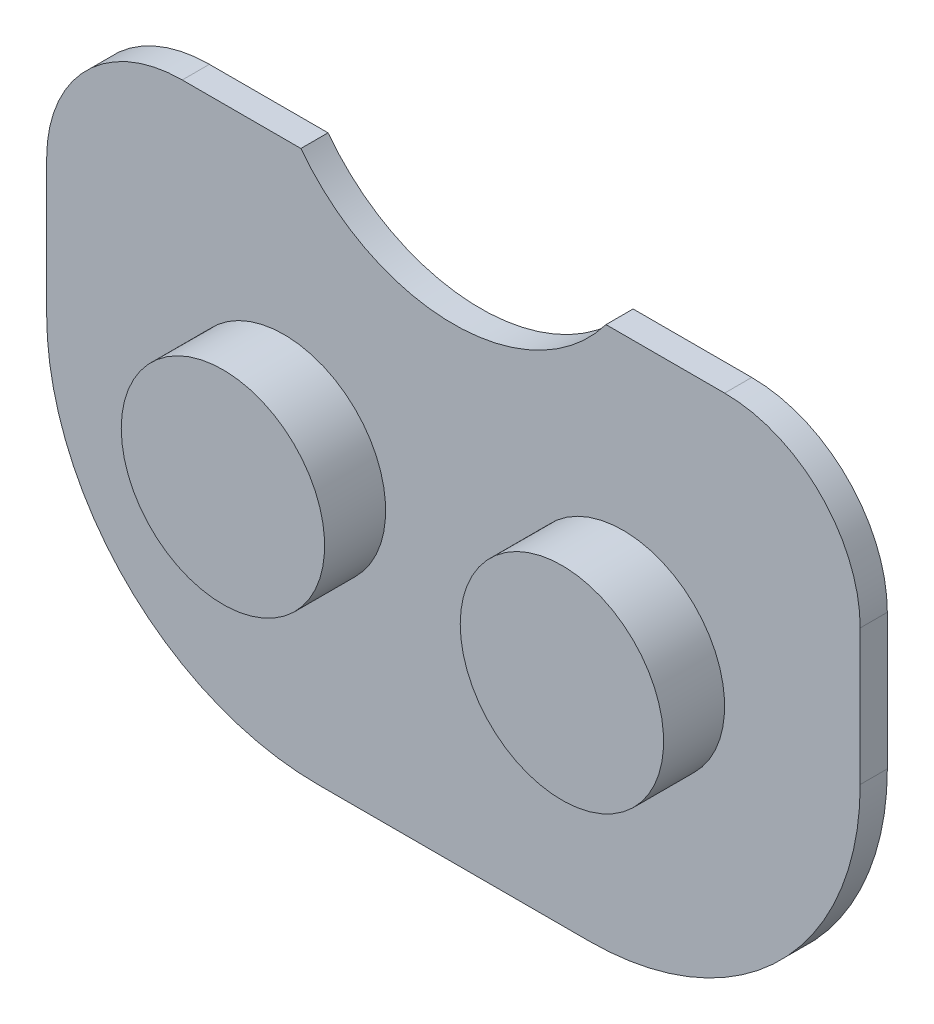
ISO-10303-21;
HEADER;
FILE_DESCRIPTION(('STEP AP214'),'2;1');
FILE_NAME('part.step','',(''),(''),'','','');
FILE_SCHEMA(('AUTOMOTIVE_DESIGN { 1 0 10303 214 1 1 1 1 }'));
ENDSEC;
DATA;
#1=APPLICATION_CONTEXT('core data for automotive mechanical design processes');
#2=APPLICATION_PROTOCOL_DEFINITION('international standard','automotive_design',2000,#1);
#3=PRODUCT_CONTEXT('',#1,'mechanical');
#4=PRODUCT('Part','Part','',(#3));
#5=PRODUCT_RELATED_PRODUCT_CATEGORY('part','',(#4));
#6=PRODUCT_DEFINITION_FORMATION('','',#4);
#7=PRODUCT_DEFINITION_CONTEXT('part definition',#1,'design');
#8=PRODUCT_DEFINITION('design','',#6,#7);
#9=PRODUCT_DEFINITION_SHAPE('','',#8);
#10=(LENGTH_UNIT() NAMED_UNIT(*) SI_UNIT(.MILLI.,.METRE.));
#11=(NAMED_UNIT(*) PLANE_ANGLE_UNIT() SI_UNIT($,.RADIAN.));
#12=(NAMED_UNIT(*) SI_UNIT($,.STERADIAN.) SOLID_ANGLE_UNIT());
#13=UNCERTAINTY_MEASURE_WITH_UNIT(LENGTH_MEASURE(1.E-05),#10,'distance_accuracy_value','');
#14=(GEOMETRIC_REPRESENTATION_CONTEXT(3) GLOBAL_UNCERTAINTY_ASSIGNED_CONTEXT((#13)) GLOBAL_UNIT_ASSIGNED_CONTEXT((#10,
#11,#12)) REPRESENTATION_CONTEXT('',''));
#15=CARTESIAN_POINT('',(0.,0.,0.));
#16=DIRECTION('',(0.,0.,1.));
#17=DIRECTION('',(1.,0.,0.));
#18=AXIS2_PLACEMENT_3D('',#15,#16,#17);
#19=CARTESIAN_POINT('',(-10.,0.,2.));
#20=DIRECTION('',(0.,0.,-1.));
#21=DIRECTION('',(-1.,0.,0.));
#22=AXIS2_PLACEMENT_3D('',#19,#20,#21);
#23=CYLINDRICAL_SURFACE('',#22,20.);
#24=CARTESIAN_POINT('',(-10.,0.,0.));
#25=DIRECTION('',(0.,0.,1.));
#26=DIRECTION('',(1.,0.,0.));
#27=AXIS2_PLACEMENT_3D('',#24,#25,#26);
#28=CIRCLE('',#27,20.);
#29=CARTESIAN_POINT('',(-9.99999999999986,-20.,0.));
#30=VERTEX_POINT('',#29);
#31=CARTESIAN_POINT('',(-30.,1.35308431126191E-13,0.));
#32=VERTEX_POINT('',#31);
#33=EDGE_CURVE('E154',#30,#32,#28,.F.);
#34=ORIENTED_EDGE('',*,*,#33,.F.);
#35=DIRECTION('',(0.,0.,-1.));
#36=VECTOR('',#35,1.);
#37=CARTESIAN_POINT('',(-9.99999999999986,-20.,2.));
#38=LINE('',#37,#36);
#39=CARTESIAN_POINT('',(-9.99999999999986,-20.,2.));
#40=VERTEX_POINT('',#39);
#41=EDGE_CURVE('E11',#40,#30,#38,.T.);
#42=ORIENTED_EDGE('',*,*,#41,.F.);
#43=CARTESIAN_POINT('',(-10.,0.,2.));
#44=DIRECTION('',(0.,0.,1.));
#45=DIRECTION('',(1.,0.,0.));
#46=AXIS2_PLACEMENT_3D('',#43,#44,#45);
#47=CIRCLE('',#46,20.);
#48=CARTESIAN_POINT('',(-30.,1.35308431126191E-13,2.));
#49=VERTEX_POINT('',#48);
#50=EDGE_CURVE('E187',#40,#49,#47,.F.);
#51=ORIENTED_EDGE('',*,*,#50,.T.);
#52=DIRECTION('',(0.,0.,-1.));
#53=VECTOR('',#52,1.);
#54=CARTESIAN_POINT('',(-30.,1.35308431126191E-13,2.));
#55=LINE('',#54,#53);
#56=EDGE_CURVE('E61',#49,#32,#55,.T.);
#57=ORIENTED_EDGE('',*,*,#56,.T.);
#58=EDGE_LOOP('',(#34,#42,#51,#57));
#59=FACE_BOUND('',#58,.T.);
#60=ADVANCED_FACE('F44',(#59),#23,.T.);
#61=CARTESIAN_POINT('',(0.,-20.,2.));
#62=DIRECTION('',(0.,-1.,0.));
#63=DIRECTION('',(1.,0.,0.));
#64=AXIS2_PLACEMENT_3D('',#61,#62,#63);
#65=PLANE('',#64);
#66=DIRECTION('',(-1.,0.,0.));
#67=VECTOR('',#66,1.);
#68=CARTESIAN_POINT('',(0.,-20.,0.));
#69=LINE('',#68,#67);
#70=CARTESIAN_POINT('',(9.99999999999986,-20.,0.));
#71=VERTEX_POINT('',#70);
#72=EDGE_CURVE('E157',#71,#30,#69,.T.);
#73=ORIENTED_EDGE('',*,*,#72,.F.);
#74=DIRECTION('',(0.,0.,-1.));
#75=VECTOR('',#74,1.);
#76=CARTESIAN_POINT('',(9.99999999999986,-20.,2.));
#77=LINE('',#76,#75);
#78=CARTESIAN_POINT('',(9.99999999999986,-20.,2.));
#79=VERTEX_POINT('',#78);
#80=EDGE_CURVE('E53',#79,#71,#77,.T.);
#81=ORIENTED_EDGE('',*,*,#80,.F.);
#82=DIRECTION('',(-1.,0.,0.));
#83=VECTOR('',#82,1.);
#84=CARTESIAN_POINT('',(0.,-20.,2.));
#85=LINE('',#84,#83);
#86=EDGE_CURVE('E243',#79,#40,#85,.T.);
#87=ORIENTED_EDGE('',*,*,#86,.T.);
#88=ORIENTED_EDGE('',*,*,#41,.T.);
#89=EDGE_LOOP('',(#73,#81,#87,#88));
#90=FACE_BOUND('',#89,.T.);
#91=ADVANCED_FACE('F218',(#90),#65,.T.);
#92=CARTESIAN_POINT('',(10.,0.,2.));
#93=DIRECTION('',(0.,0.,-1.));
#94=DIRECTION('',(-1.,0.,0.));
#95=AXIS2_PLACEMENT_3D('',#92,#93,#94);
#96=CYLINDRICAL_SURFACE('',#95,20.);
#97=CARTESIAN_POINT('',(10.,0.,0.));
#98=DIRECTION('',(0.,0.,1.));
#99=DIRECTION('',(1.,0.,0.));
#100=AXIS2_PLACEMENT_3D('',#97,#98,#99);
#101=CIRCLE('',#100,20.);
#102=CARTESIAN_POINT('',(30.,1.38777878078145E-13,0.));
#103=VERTEX_POINT('',#102);
#104=EDGE_CURVE('E162',#103,#71,#101,.F.);
#105=ORIENTED_EDGE('',*,*,#104,.F.);
#106=DIRECTION('',(0.,0.,-1.));
#107=VECTOR('',#106,1.);
#108=CARTESIAN_POINT('',(30.,1.38777878078145E-13,2.));
#109=LINE('',#108,#107);
#110=CARTESIAN_POINT('',(30.,1.38777878078145E-13,2.));
#111=VERTEX_POINT('',#110);
#112=EDGE_CURVE('E205',#111,#103,#109,.T.);
#113=ORIENTED_EDGE('',*,*,#112,.F.);
#114=CARTESIAN_POINT('',(10.,0.,2.));
#115=DIRECTION('',(0.,0.,1.));
#116=DIRECTION('',(1.,0.,0.));
#117=AXIS2_PLACEMENT_3D('',#114,#115,#116);
#118=CIRCLE('',#117,20.);
#119=EDGE_CURVE('E214',#111,#79,#118,.F.);
#120=ORIENTED_EDGE('',*,*,#119,.T.);
#121=ORIENTED_EDGE('',*,*,#80,.T.);
#122=EDGE_LOOP('',(#105,#113,#120,#121));
#123=FACE_BOUND('',#122,.T.);
#124=ADVANCED_FACE('F212',(#123),#96,.T.);
#125=CARTESIAN_POINT('',(30.,0.,2.));
#126=DIRECTION('',(-1.,0.,0.));
#127=DIRECTION('',(0.,0.,1.));
#128=AXIS2_PLACEMENT_3D('',#125,#126,#127);
#129=PLANE('',#128);
#130=DIRECTION('',(0.,1.,0.));
#131=VECTOR('',#130,1.);
#132=CARTESIAN_POINT('',(30.,0.,0.));
#133=LINE('',#132,#131);
#134=CARTESIAN_POINT('',(30.,9.99999999999993,0.));
#135=VERTEX_POINT('',#134);
#136=EDGE_CURVE('E166',#103,#135,#133,.T.);
#137=ORIENTED_EDGE('',*,*,#136,.T.);
#138=DIRECTION('',(0.,0.,-1.));
#139=VECTOR('',#138,1.);
#140=CARTESIAN_POINT('',(30.,9.99999999999993,2.));
#141=LINE('',#140,#139);
#142=CARTESIAN_POINT('',(30.,9.99999999999993,2.));
#143=VERTEX_POINT('',#142);
#144=EDGE_CURVE('E201',#143,#135,#141,.T.);
#145=ORIENTED_EDGE('',*,*,#144,.F.);
#146=DIRECTION('',(0.,1.,0.));
#147=VECTOR('',#146,1.);
#148=CARTESIAN_POINT('',(30.,0.,2.));
#149=LINE('',#148,#147);
#150=EDGE_CURVE('E235',#111,#143,#149,.T.);
#151=ORIENTED_EDGE('',*,*,#150,.F.);
#152=ORIENTED_EDGE('',*,*,#112,.T.);
#153=EDGE_LOOP('',(#137,#145,#151,#152));
#154=FACE_BOUND('',#153,.T.);
#155=ADVANCED_FACE('F226',(#154),#129,.F.);
#156=CARTESIAN_POINT('',(20.,10.,2.));
#157=DIRECTION('',(0.,0.,-1.));
#158=DIRECTION('',(-1.,0.,0.));
#159=AXIS2_PLACEMENT_3D('',#156,#157,#158);
#160=CYLINDRICAL_SURFACE('',#159,10.);
#161=CARTESIAN_POINT('',(20.,10.,0.));
#162=DIRECTION('',(0.,0.,1.));
#163=DIRECTION('',(1.,0.,0.));
#164=AXIS2_PLACEMENT_3D('',#161,#162,#163);
#165=CIRCLE('',#164,10.);
#166=CARTESIAN_POINT('',(19.9999999999999,20.,0.));
#167=VERTEX_POINT('',#166);
#168=EDGE_CURVE('E169',#135,#167,#165,.T.);
#169=ORIENTED_EDGE('',*,*,#168,.T.);
#170=DIRECTION('',(0.,0.,-1.));
#171=VECTOR('',#170,1.);
#172=CARTESIAN_POINT('',(19.9999999999999,20.,2.));
#173=LINE('',#172,#171);
#174=CARTESIAN_POINT('',(19.9999999999999,20.,2.));
#175=VERTEX_POINT('',#174);
#176=EDGE_CURVE('E197',#175,#167,#173,.T.);
#177=ORIENTED_EDGE('',*,*,#176,.F.);
#178=CARTESIAN_POINT('',(20.,10.,2.));
#179=DIRECTION('',(0.,0.,1.));
#180=DIRECTION('',(1.,0.,0.));
#181=AXIS2_PLACEMENT_3D('',#178,#179,#180);
#182=CIRCLE('',#181,10.);
#183=EDGE_CURVE('E232',#143,#175,#182,.T.);
#184=ORIENTED_EDGE('',*,*,#183,.F.);
#185=ORIENTED_EDGE('',*,*,#144,.T.);
#186=EDGE_LOOP('',(#169,#177,#184,#185));
#187=FACE_BOUND('',#186,.T.);
#188=ADVANCED_FACE('F230',(#187),#160,.T.);
#189=CARTESIAN_POINT('',(0.,20.,2.));
#190=DIRECTION('',(0.,-1.,0.));
#191=DIRECTION('',(1.,0.,0.));
#192=AXIS2_PLACEMENT_3D('',#189,#190,#191);
#193=PLANE('',#192);
#194=DIRECTION('',(-1.,0.,0.));
#195=VECTOR('',#194,1.);
#196=CARTESIAN_POINT('',(0.,20.,0.));
#197=LINE('',#196,#195);
#198=CARTESIAN_POINT('',(11.2498888883402,20.,0.));
#199=VERTEX_POINT('',#198);
#200=EDGE_CURVE('E172',#167,#199,#197,.T.);
#201=ORIENTED_EDGE('',*,*,#200,.T.);
#202=DIRECTION('',(0.,0.,-1.));
#203=VECTOR('',#202,1.);
#204=CARTESIAN_POINT('',(11.2498888883402,20.,2.));
#205=LINE('',#204,#203);
#206=CARTESIAN_POINT('',(11.2498888883402,20.,2.));
#207=VERTEX_POINT('',#206);
#208=EDGE_CURVE('E194',#207,#199,#205,.T.);
#209=ORIENTED_EDGE('',*,*,#208,.F.);
#210=DIRECTION('',(-1.,0.,0.));
#211=VECTOR('',#210,1.);
#212=CARTESIAN_POINT('',(0.,20.,2.));
#213=LINE('',#212,#211);
#214=EDGE_CURVE('E135',#175,#207,#213,.T.);
#215=ORIENTED_EDGE('',*,*,#214,.F.);
#216=ORIENTED_EDGE('',*,*,#176,.T.);
#217=EDGE_LOOP('',(#201,#209,#215,#216));
#218=FACE_BOUND('',#217,.T.);
#219=ADVANCED_FACE('F299',(#218),#193,.F.);
#220=CARTESIAN_POINT('',(0.,28.5,2.));
#221=DIRECTION('',(0.,0.,-1.));
#222=DIRECTION('',(-1.,0.,0.));
#223=AXIS2_PLACEMENT_3D('',#220,#221,#222);
#224=CYLINDRICAL_SURFACE('',#223,14.1);
#225=CARTESIAN_POINT('',(0.,28.5,0.));
#226=DIRECTION('',(0.,0.,1.));
#227=DIRECTION('',(1.,0.,0.));
#228=AXIS2_PLACEMENT_3D('',#225,#226,#227);
#229=CIRCLE('',#228,14.1);
#230=CARTESIAN_POINT('',(-11.2498888883402,20.,0.));
#231=VERTEX_POINT('',#230);
#232=EDGE_CURVE('E176',#231,#199,#229,.T.);
#233=ORIENTED_EDGE('',*,*,#232,.F.);
#234=DIRECTION('',(0.,0.,-1.));
#235=VECTOR('',#234,1.);
#236=CARTESIAN_POINT('',(-11.2498888883402,20.,2.));
#237=LINE('',#236,#235);
#238=CARTESIAN_POINT('',(-11.2498888883402,20.,2.));
#239=VERTEX_POINT('',#238);
#240=EDGE_CURVE('E144',#239,#231,#237,.T.);
#241=ORIENTED_EDGE('',*,*,#240,.F.);
#242=CARTESIAN_POINT('',(0.,28.5,2.));
#243=DIRECTION('',(0.,0.,1.));
#244=DIRECTION('',(1.,0.,0.));
#245=AXIS2_PLACEMENT_3D('',#242,#243,#244);
#246=CIRCLE('',#245,14.1);
#247=EDGE_CURVE('E131',#239,#207,#246,.T.);
#248=ORIENTED_EDGE('',*,*,#247,.T.);
#249=ORIENTED_EDGE('',*,*,#208,.T.);
#250=EDGE_LOOP('',(#233,#241,#248,#249));
#251=FACE_BOUND('',#250,.T.);
#252=ADVANCED_FACE('F298',(#251),#224,.F.);
#253=CARTESIAN_POINT('',(-19.9999999999999,20.,0.));
#254=VERTEX_POINT('',#253);
#255=EDGE_CURVE('E140',#231,#254,#197,.T.);
#256=ORIENTED_EDGE('',*,*,#255,.T.);
#257=DIRECTION('',(0.,0.,-1.));
#258=VECTOR('',#257,1.);
#259=CARTESIAN_POINT('',(-19.9999999999999,20.,2.));
#260=LINE('',#259,#258);
#261=CARTESIAN_POINT('',(-19.9999999999999,20.,2.));
#262=VERTEX_POINT('',#261);
#263=EDGE_CURVE('E137',#262,#254,#260,.T.);
#264=ORIENTED_EDGE('',*,*,#263,.F.);
#265=EDGE_CURVE('E124',#239,#262,#213,.T.);
#266=ORIENTED_EDGE('',*,*,#265,.F.);
#267=ORIENTED_EDGE('',*,*,#240,.T.);
#268=EDGE_LOOP('',(#256,#264,#266,#267));
#269=FACE_BOUND('',#268,.T.);
#270=ADVANCED_FACE('F138',(#269),#193,.F.);
#271=CARTESIAN_POINT('',(-20.,9.99999999999999,2.));
#272=DIRECTION('',(0.,0.,-1.));
#273=DIRECTION('',(-1.,0.,0.));
#274=AXIS2_PLACEMENT_3D('',#271,#272,#273);
#275=CYLINDRICAL_SURFACE('',#274,10.);
#276=CARTESIAN_POINT('',(-20.,9.99999999999999,0.));
#277=DIRECTION('',(0.,0.,1.));
#278=DIRECTION('',(1.,0.,0.));
#279=AXIS2_PLACEMENT_3D('',#276,#277,#278);
#280=CIRCLE('',#279,10.);
#281=CARTESIAN_POINT('',(-30.,9.99999999999992,0.));
#282=VERTEX_POINT('',#281);
#283=EDGE_CURVE('E180',#282,#254,#280,.F.);
#284=ORIENTED_EDGE('',*,*,#283,.F.);
#285=DIRECTION('',(0.,0.,-1.));
#286=VECTOR('',#285,1.);
#287=CARTESIAN_POINT('',(-30.,9.99999999999992,2.));
#288=LINE('',#287,#286);
#289=CARTESIAN_POINT('',(-30.,9.99999999999992,2.));
#290=VERTEX_POINT('',#289);
#291=EDGE_CURVE('E92',#290,#282,#288,.T.);
#292=ORIENTED_EDGE('',*,*,#291,.F.);
#293=CARTESIAN_POINT('',(-20.,9.99999999999999,2.));
#294=DIRECTION('',(0.,0.,1.));
#295=DIRECTION('',(1.,0.,0.));
#296=AXIS2_PLACEMENT_3D('',#293,#294,#295);
#297=CIRCLE('',#296,10.);
#298=EDGE_CURVE('E129',#290,#262,#297,.F.);
#299=ORIENTED_EDGE('',*,*,#298,.T.);
#300=ORIENTED_EDGE('',*,*,#263,.T.);
#301=EDGE_LOOP('',(#284,#292,#299,#300));
#302=FACE_BOUND('',#301,.T.);
#303=ADVANCED_FACE('F146',(#302),#275,.T.);
#304=CARTESIAN_POINT('',(-30.,0.,2.));
#305=DIRECTION('',(-1.,0.,0.));
#306=DIRECTION('',(0.,0.,1.));
#307=AXIS2_PLACEMENT_3D('',#304,#305,#306);
#308=PLANE('',#307);
#309=DIRECTION('',(0.,1.,0.));
#310=VECTOR('',#309,1.);
#311=CARTESIAN_POINT('',(-30.,0.,0.));
#312=LINE('',#311,#310);
#313=EDGE_CURVE('E183',#32,#282,#312,.T.);
#314=ORIENTED_EDGE('',*,*,#313,.F.);
#315=ORIENTED_EDGE('',*,*,#56,.F.);
#316=DIRECTION('',(0.,1.,0.));
#317=VECTOR('',#316,1.);
#318=CARTESIAN_POINT('',(-30.,0.,2.));
#319=LINE('',#318,#317);
#320=EDGE_CURVE('E148',#49,#290,#319,.T.);
#321=ORIENTED_EDGE('',*,*,#320,.T.);
#322=ORIENTED_EDGE('',*,*,#291,.T.);
#323=EDGE_LOOP('',(#314,#315,#321,#322));
#324=FACE_BOUND('',#323,.T.);
#325=ADVANCED_FACE('F284',(#324),#308,.T.);
#326=CARTESIAN_POINT('',(0.,0.,2.));
#327=DIRECTION('',(0.,0.,1.));
#328=DIRECTION('',(1.,0.,0.));
#329=AXIS2_PLACEMENT_3D('',#326,#327,#328);
#330=PLANE('',#329);
#331=CARTESIAN_POINT('',(12.5,0.,2.));
#332=DIRECTION('',(0.,0.,1.));
#333=DIRECTION('',(1.,0.,0.));
#334=AXIS2_PLACEMENT_3D('',#331,#332,#333);
#335=CIRCLE('',#334,7.5);
#336=CARTESIAN_POINT('',(5.,0.,2.));
#337=VERTEX_POINT('',#336);
#338=EDGE_CURVE('E255',#337,#337,#335,.F.);
#339=ORIENTED_EDGE('',*,*,#338,.T.);
#340=EDGE_LOOP('',(#339));
#341=FACE_BOUND('',#340,.T.);
#342=CARTESIAN_POINT('',(-12.5,0.,2.));
#343=DIRECTION('',(0.,0.,1.));
#344=DIRECTION('',(1.,0.,0.));
#345=AXIS2_PLACEMENT_3D('',#342,#343,#344);
#346=CIRCLE('',#345,7.5);
#347=CARTESIAN_POINT('',(-20.,0.,2.));
#348=VERTEX_POINT('',#347);
#349=EDGE_CURVE('E158',#348,#348,#346,.F.);
#350=ORIENTED_EDGE('',*,*,#349,.T.);
#351=EDGE_LOOP('',(#350));
#352=FACE_BOUND('',#351,.T.);
#353=ORIENTED_EDGE('',*,*,#50,.F.);
#354=ORIENTED_EDGE('',*,*,#86,.F.);
#355=ORIENTED_EDGE('',*,*,#119,.F.);
#356=ORIENTED_EDGE('',*,*,#150,.T.);
#357=ORIENTED_EDGE('',*,*,#183,.T.);
#358=ORIENTED_EDGE('',*,*,#214,.T.);
#359=ORIENTED_EDGE('',*,*,#247,.F.);
#360=ORIENTED_EDGE('',*,*,#265,.T.);
#361=ORIENTED_EDGE('',*,*,#298,.F.);
#362=ORIENTED_EDGE('',*,*,#320,.F.);
#363=EDGE_LOOP('',(#353,#354,#355,#356,#357,#358,#359,#360,#361,#362));
#364=FACE_BOUND('',#363,.T.);
#365=ADVANCED_FACE('F126',(#341,#352,#364),#330,.T.);
#366=CARTESIAN_POINT('',(0.,0.,0.));
#367=DIRECTION('',(0.,0.,1.));
#368=DIRECTION('',(1.,0.,0.));
#369=AXIS2_PLACEMENT_3D('',#366,#367,#368);
#370=PLANE('',#369);
#371=ORIENTED_EDGE('',*,*,#33,.T.);
#372=ORIENTED_EDGE('',*,*,#313,.T.);
#373=ORIENTED_EDGE('',*,*,#283,.T.);
#374=ORIENTED_EDGE('',*,*,#255,.F.);
#375=ORIENTED_EDGE('',*,*,#232,.T.);
#376=ORIENTED_EDGE('',*,*,#200,.F.);
#377=ORIENTED_EDGE('',*,*,#168,.F.);
#378=ORIENTED_EDGE('',*,*,#136,.F.);
#379=ORIENTED_EDGE('',*,*,#104,.T.);
#380=ORIENTED_EDGE('',*,*,#72,.T.);
#381=EDGE_LOOP('',(#371,#372,#373,#374,#375,#376,#377,#378,#379,#380));
#382=FACE_BOUND('',#381,.T.);
#383=ADVANCED_FACE('F221',(#382),#370,.F.);
#384=CARTESIAN_POINT('',(-12.5,0.,6.5));
#385=DIRECTION('',(0.,0.,-1.));
#386=DIRECTION('',(-1.,0.,0.));
#387=AXIS2_PLACEMENT_3D('',#384,#385,#386);
#388=CYLINDRICAL_SURFACE('',#387,7.5);
#389=CARTESIAN_POINT('',(-12.5,0.,6.5));
#390=DIRECTION('',(0.,0.,1.));
#391=DIRECTION('',(1.,0.,0.));
#392=AXIS2_PLACEMENT_3D('',#389,#390,#391);
#393=CIRCLE('',#392,7.5);
#394=CARTESIAN_POINT('',(-20.,0.,6.5));
#395=VERTEX_POINT('',#394);
#396=EDGE_CURVE('E251',#395,#395,#393,.T.);
#397=CARTESIAN_POINT('',(-20.,0.,2.));
#398=CARTESIAN_POINT('',(-20.,0.,2.046875));
#399=CARTESIAN_POINT('',(-20.,0.,2.09375));
#400=CARTESIAN_POINT('',(-20.,0.,2.1875));
#401=CARTESIAN_POINT('',(-20.,0.,2.234375));
#402=CARTESIAN_POINT('',(-20.,0.,2.328125));
#403=CARTESIAN_POINT('',(-20.,0.,2.375));
#404=CARTESIAN_POINT('',(-20.,0.,2.46875));
#405=CARTESIAN_POINT('',(-20.,0.,2.515625));
#406=CARTESIAN_POINT('',(-20.,0.,2.609375));
#407=CARTESIAN_POINT('',(-20.,0.,2.65625));
#408=CARTESIAN_POINT('',(-20.,0.,2.75));
#409=CARTESIAN_POINT('',(-20.,0.,2.796875));
#410=CARTESIAN_POINT('',(-20.,0.,2.890625));
#411=CARTESIAN_POINT('',(-20.,0.,2.9375));
#412=CARTESIAN_POINT('',(-20.,0.,3.03125));
#413=CARTESIAN_POINT('',(-20.,0.,3.078125));
#414=CARTESIAN_POINT('',(-20.,0.,3.171875));
#415=CARTESIAN_POINT('',(-20.,0.,3.21875));
#416=CARTESIAN_POINT('',(-20.,0.,3.3125));
#417=CARTESIAN_POINT('',(-20.,0.,3.359375));
#418=CARTESIAN_POINT('',(-20.,0.,3.453125));
#419=CARTESIAN_POINT('',(-20.,0.,3.5));
#420=CARTESIAN_POINT('',(-20.,0.,3.59375));
#421=CARTESIAN_POINT('',(-20.,0.,3.640625));
#422=CARTESIAN_POINT('',(-20.,0.,3.734375));
#423=CARTESIAN_POINT('',(-20.,0.,3.78125));
#424=CARTESIAN_POINT('',(-20.,0.,3.875));
#425=CARTESIAN_POINT('',(-20.,0.,3.921875));
#426=CARTESIAN_POINT('',(-20.,0.,4.015625));
#427=CARTESIAN_POINT('',(-20.,0.,4.0625));
#428=CARTESIAN_POINT('',(-20.,0.,4.15625));
#429=CARTESIAN_POINT('',(-20.,0.,4.203125));
#430=CARTESIAN_POINT('',(-20.,0.,4.296875));
#431=CARTESIAN_POINT('',(-20.,0.,4.34375));
#432=CARTESIAN_POINT('',(-20.,0.,4.4375));
#433=CARTESIAN_POINT('',(-20.,0.,4.484375));
#434=CARTESIAN_POINT('',(-20.,0.,4.578125));
#435=CARTESIAN_POINT('',(-20.,0.,4.625));
#436=CARTESIAN_POINT('',(-20.,0.,4.71875));
#437=CARTESIAN_POINT('',(-20.,0.,4.765625));
#438=CARTESIAN_POINT('',(-20.,0.,4.859375));
#439=CARTESIAN_POINT('',(-20.,0.,4.90625));
#440=CARTESIAN_POINT('',(-20.,0.,5.));
#441=CARTESIAN_POINT('',(-20.,0.,5.046875));
#442=CARTESIAN_POINT('',(-20.,0.,5.140625));
#443=CARTESIAN_POINT('',(-20.,0.,5.1875));
#444=CARTESIAN_POINT('',(-20.,0.,5.28125));
#445=CARTESIAN_POINT('',(-20.,0.,5.328125));
#446=CARTESIAN_POINT('',(-20.,0.,5.421875));
#447=CARTESIAN_POINT('',(-20.,0.,5.46875));
#448=CARTESIAN_POINT('',(-20.,0.,5.5625));
#449=CARTESIAN_POINT('',(-20.,0.,5.609375));
#450=CARTESIAN_POINT('',(-20.,0.,5.703125));
#451=CARTESIAN_POINT('',(-20.,0.,5.75));
#452=CARTESIAN_POINT('',(-20.,0.,5.84375));
#453=CARTESIAN_POINT('',(-20.,0.,5.890625));
#454=CARTESIAN_POINT('',(-20.,0.,5.984375));
#455=CARTESIAN_POINT('',(-20.,0.,6.03125));
#456=CARTESIAN_POINT('',(-20.,0.,6.125));
#457=CARTESIAN_POINT('',(-20.,0.,6.171875));
#458=CARTESIAN_POINT('',(-20.,0.,6.265625));
#459=CARTESIAN_POINT('',(-20.,0.,6.3125));
#460=CARTESIAN_POINT('',(-20.,0.,6.40625));
#461=CARTESIAN_POINT('',(-20.,0.,6.453125));
#462=CARTESIAN_POINT('',(-20.,0.,6.5));
#463=B_SPLINE_CURVE_WITH_KNOTS('',3,(#397,#398,#399,#400,#401,#402,#403,#404,#405,#406,#407,
#408,#409,#410,#411,#412,#413,#414,#415,#416,#417,#418,#419,#420,#421,#422,#423,#424,#425,#426,
#427,#428,#429,#430,#431,#432,#433,#434,#435,#436,#437,#438,#439,#440,#441,#442,#443,#444,#445,
#446,#447,#448,#449,#450,#451,#452,#453,#454,#455,#456,#457,#458,#459,#460,#461,#462),
.UNSPECIFIED.,.F.,.F.,(4,2,2,2,2,2,2,2,2,2,2,2,2,2,2,2,2,2,2,2,2,2,2,2,2,2,2,2,2,2,2,2,4),(0.,
0.140625,0.28125,0.421875,0.5625,0.703125,0.843749999999999,0.984375,1.125,1.265625,1.40625,
1.546875,1.6875,1.828125,1.96875,2.109375,2.25,2.390625,2.53125,2.671875,2.8125,2.953125,
3.09375,3.234375,3.375,3.515625,3.65625,3.796875,3.9375,4.078125,4.21875,4.359375,4.5),.UNSPECIFIED.);
#464=EDGE_CURVE('BSEAM276',#348,#395,#463,.T.);
#465=ORIENTED_EDGE('',*,*,#349,.F.);
#466=ORIENTED_EDGE('',*,*,#396,.F.);
#467=ORIENTED_EDGE('',*,*,#464,.T.);
#468=ORIENTED_EDGE('',*,*,#464,.F.);
#469=EDGE_LOOP('',(#465,#467,#466,#468));
#470=FACE_BOUND('',#469,.T.);
#471=ADVANCED_FACE('F276',(#470),#388,.T.);
#472=CARTESIAN_POINT('',(-12.5,0.,6.5));
#473=DIRECTION('',(0.,0.,1.));
#474=DIRECTION('',(1.,0.,0.));
#475=AXIS2_PLACEMENT_3D('',#472,#473,#474);
#476=PLANE('',#475);
#477=ORIENTED_EDGE('',*,*,#396,.T.);
#478=EDGE_LOOP('',(#477));
#479=FACE_BOUND('',#478,.T.);
#480=ADVANCED_FACE('F268',(#479),#476,.T.);
#481=CARTESIAN_POINT('',(12.5,0.,6.5));
#482=DIRECTION('',(0.,0.,-1.));
#483=DIRECTION('',(-1.,0.,0.));
#484=AXIS2_PLACEMENT_3D('',#481,#482,#483);
#485=CYLINDRICAL_SURFACE('',#484,7.5);
#486=CARTESIAN_POINT('',(12.5,0.,6.5));
#487=DIRECTION('',(0.,0.,1.));
#488=DIRECTION('',(1.,0.,0.));
#489=AXIS2_PLACEMENT_3D('',#486,#487,#488);
#490=CIRCLE('',#489,7.5);
#491=CARTESIAN_POINT('',(5.,0.,6.5));
#492=VERTEX_POINT('',#491);
#493=EDGE_CURVE('E259',#492,#492,#490,.T.);
#494=CARTESIAN_POINT('',(5.,0.,2.));
#495=CARTESIAN_POINT('',(5.,0.,2.046875));
#496=CARTESIAN_POINT('',(5.,0.,2.09375));
#497=CARTESIAN_POINT('',(5.,0.,2.1875));
#498=CARTESIAN_POINT('',(5.,0.,2.234375));
#499=CARTESIAN_POINT('',(5.,0.,2.328125));
#500=CARTESIAN_POINT('',(5.,0.,2.375));
#501=CARTESIAN_POINT('',(5.,0.,2.46875));
#502=CARTESIAN_POINT('',(5.,0.,2.515625));
#503=CARTESIAN_POINT('',(5.,0.,2.609375));
#504=CARTESIAN_POINT('',(5.,0.,2.65625));
#505=CARTESIAN_POINT('',(5.,0.,2.75));
#506=CARTESIAN_POINT('',(5.,0.,2.796875));
#507=CARTESIAN_POINT('',(5.,0.,2.890625));
#508=CARTESIAN_POINT('',(5.,0.,2.9375));
#509=CARTESIAN_POINT('',(5.,0.,3.03125));
#510=CARTESIAN_POINT('',(5.,0.,3.078125));
#511=CARTESIAN_POINT('',(5.,0.,3.171875));
#512=CARTESIAN_POINT('',(5.,0.,3.21875));
#513=CARTESIAN_POINT('',(5.,0.,3.3125));
#514=CARTESIAN_POINT('',(5.,0.,3.359375));
#515=CARTESIAN_POINT('',(5.,0.,3.453125));
#516=CARTESIAN_POINT('',(5.,0.,3.5));
#517=CARTESIAN_POINT('',(5.,0.,3.59375));
#518=CARTESIAN_POINT('',(5.,0.,3.640625));
#519=CARTESIAN_POINT('',(5.,0.,3.734375));
#520=CARTESIAN_POINT('',(5.,0.,3.78125));
#521=CARTESIAN_POINT('',(5.,0.,3.875));
#522=CARTESIAN_POINT('',(5.,0.,3.921875));
#523=CARTESIAN_POINT('',(5.,0.,4.015625));
#524=CARTESIAN_POINT('',(5.,0.,4.0625));
#525=CARTESIAN_POINT('',(5.,0.,4.15625));
#526=CARTESIAN_POINT('',(5.,0.,4.203125));
#527=CARTESIAN_POINT('',(5.,0.,4.296875));
#528=CARTESIAN_POINT('',(5.,0.,4.34375));
#529=CARTESIAN_POINT('',(5.,0.,4.4375));
#530=CARTESIAN_POINT('',(5.,0.,4.484375));
#531=CARTESIAN_POINT('',(5.,0.,4.578125));
#532=CARTESIAN_POINT('',(5.,0.,4.625));
#533=CARTESIAN_POINT('',(5.,0.,4.71875));
#534=CARTESIAN_POINT('',(5.,0.,4.765625));
#535=CARTESIAN_POINT('',(5.,0.,4.859375));
#536=CARTESIAN_POINT('',(5.,0.,4.90625));
#537=CARTESIAN_POINT('',(5.,0.,5.));
#538=CARTESIAN_POINT('',(5.,0.,5.046875));
#539=CARTESIAN_POINT('',(5.,0.,5.140625));
#540=CARTESIAN_POINT('',(5.,0.,5.1875));
#541=CARTESIAN_POINT('',(5.,0.,5.28125));
#542=CARTESIAN_POINT('',(5.,0.,5.328125));
#543=CARTESIAN_POINT('',(5.,0.,5.421875));
#544=CARTESIAN_POINT('',(5.,0.,5.46875));
#545=CARTESIAN_POINT('',(5.,0.,5.5625));
#546=CARTESIAN_POINT('',(5.,0.,5.609375));
#547=CARTESIAN_POINT('',(5.,0.,5.703125));
#548=CARTESIAN_POINT('',(5.,0.,5.75));
#549=CARTESIAN_POINT('',(5.,0.,5.84375));
#550=CARTESIAN_POINT('',(5.,0.,5.890625));
#551=CARTESIAN_POINT('',(5.,0.,5.984375));
#552=CARTESIAN_POINT('',(5.,0.,6.03125));
#553=CARTESIAN_POINT('',(5.,0.,6.125));
#554=CARTESIAN_POINT('',(5.,0.,6.171875));
#555=CARTESIAN_POINT('',(5.,0.,6.265625));
#556=CARTESIAN_POINT('',(5.,0.,6.3125));
#557=CARTESIAN_POINT('',(5.,0.,6.40625));
#558=CARTESIAN_POINT('',(5.,0.,6.453125));
#559=CARTESIAN_POINT('',(5.,0.,6.5));
#560=B_SPLINE_CURVE_WITH_KNOTS('',3,(#494,#495,#496,#497,#498,#499,#500,#501,#502,#503,#504,
#505,#506,#507,#508,#509,#510,#511,#512,#513,#514,#515,#516,#517,#518,#519,#520,#521,#522,#523,
#524,#525,#526,#527,#528,#529,#530,#531,#532,#533,#534,#535,#536,#537,#538,#539,#540,#541,#542,
#543,#544,#545,#546,#547,#548,#549,#550,#551,#552,#553,#554,#555,#556,#557,#558,#559),
.UNSPECIFIED.,.F.,.F.,(4,2,2,2,2,2,2,2,2,2,2,2,2,2,2,2,2,2,2,2,2,2,2,2,2,2,2,2,2,2,2,2,4),(0.,
0.140625,0.28125,0.421875,0.5625,0.703125,0.843749999999999,0.984375,1.125,1.265625,1.40625,
1.546875,1.6875,1.828125,1.96875,2.109375,2.25,2.390625,2.53125,2.671875,2.8125,2.953125,
3.09375,3.234375,3.375,3.515625,3.65625,3.796875,3.9375,4.078125,4.21875,4.359375,4.5),.UNSPECIFIED.);
#561=EDGE_CURVE('BSEAM266',#337,#492,#560,.T.);
#562=ORIENTED_EDGE('',*,*,#338,.F.);
#563=ORIENTED_EDGE('',*,*,#493,.F.);
#564=ORIENTED_EDGE('',*,*,#561,.T.);
#565=ORIENTED_EDGE('',*,*,#561,.F.);
#566=EDGE_LOOP('',(#562,#564,#563,#565));
#567=FACE_BOUND('',#566,.T.);
#568=ADVANCED_FACE('F266',(#567),#485,.T.);
#569=CARTESIAN_POINT('',(12.5,0.,6.5));
#570=DIRECTION('',(0.,0.,1.));
#571=DIRECTION('',(1.,0.,0.));
#572=AXIS2_PLACEMENT_3D('',#569,#570,#571);
#573=PLANE('',#572);
#574=ORIENTED_EDGE('',*,*,#493,.T.);
#575=EDGE_LOOP('',(#574));
#576=FACE_BOUND('',#575,.T.);
#577=ADVANCED_FACE('F264',(#576),#573,.T.);
#578=CLOSED_SHELL('',(#60,#91,#124,#155,#188,#219,#252,#270,#303,#325,#365,#383,#471,#480,#568,#577));
#579=MANIFOLD_SOLID_BREP('B2',#578);
#580=ADVANCED_BREP_SHAPE_REPRESENTATION('',(#18,#579),#14);
#581=SHAPE_DEFINITION_REPRESENTATION(#9,#580);
ENDSEC;
END-ISO-10303-21;
